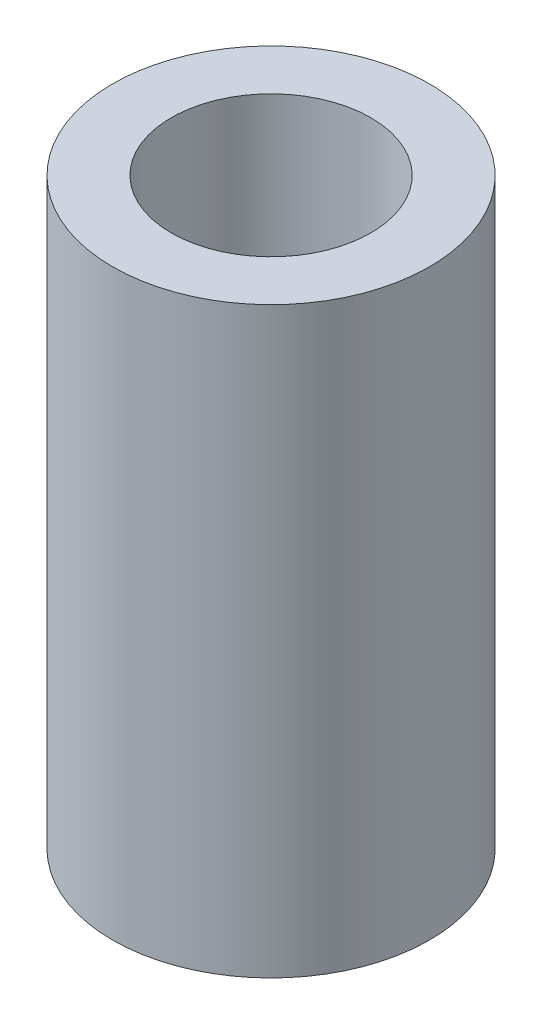
ISO-10303-21;
HEADER;
FILE_DESCRIPTION(('STEP AP214'),'2;1');
FILE_NAME('part.step','',(''),(''),'','','');
FILE_SCHEMA(('AUTOMOTIVE_DESIGN { 1 0 10303 214 1 1 1 1 }'));
ENDSEC;
DATA;
#1=APPLICATION_CONTEXT('core data for automotive mechanical design processes');
#2=APPLICATION_PROTOCOL_DEFINITION('international standard','automotive_design',2000,#1);
#3=PRODUCT_CONTEXT('',#1,'mechanical');
#4=PRODUCT('Part','Part','',(#3));
#5=PRODUCT_RELATED_PRODUCT_CATEGORY('part','',(#4));
#6=PRODUCT_DEFINITION_FORMATION('','',#4);
#7=PRODUCT_DEFINITION_CONTEXT('part definition',#1,'design');
#8=PRODUCT_DEFINITION('design','',#6,#7);
#9=PRODUCT_DEFINITION_SHAPE('','',#8);
#10=(LENGTH_UNIT() NAMED_UNIT(*) SI_UNIT(.MILLI.,.METRE.));
#11=(NAMED_UNIT(*) PLANE_ANGLE_UNIT() SI_UNIT($,.RADIAN.));
#12=(NAMED_UNIT(*) SI_UNIT($,.STERADIAN.) SOLID_ANGLE_UNIT());
#13=UNCERTAINTY_MEASURE_WITH_UNIT(LENGTH_MEASURE(1.E-05),#10,'distance_accuracy_value','');
#14=(GEOMETRIC_REPRESENTATION_CONTEXT(3) GLOBAL_UNCERTAINTY_ASSIGNED_CONTEXT((#13)) GLOBAL_UNIT_ASSIGNED_CONTEXT((#10,
#11,#12)) REPRESENTATION_CONTEXT('',''));
#15=CARTESIAN_POINT('',(0.,0.,0.));
#16=DIRECTION('',(0.,0.,1.));
#17=DIRECTION('',(1.,0.,0.));
#18=AXIS2_PLACEMENT_3D('',#15,#16,#17);
#19=CARTESIAN_POINT('',(0.,-11.684,0.));
#20=DIRECTION('',(0.,1.,0.));
#21=DIRECTION('',(0.,0.,1.));
#22=AXIS2_PLACEMENT_3D('',#19,#20,#21);
#23=CYLINDRICAL_SURFACE('',#22,3.175);
#24=CARTESIAN_POINT('',(0.,-11.684,0.));
#25=DIRECTION('',(0.,1.,0.));
#26=DIRECTION('',(0.,0.,1.));
#27=AXIS2_PLACEMENT_3D('',#24,#25,#26);
#28=CIRCLE('',#27,3.175);
#29=CARTESIAN_POINT('',(0.,-11.684,3.175));
#30=VERTEX_POINT('',#29);
#31=EDGE_CURVE('E10',#30,#30,#28,.T.);
#32=ORIENTED_EDGE('',*,*,#31,.T.);
#33=EDGE_LOOP('',(#32));
#34=FACE_BOUND('',#33,.T.);
#35=CARTESIAN_POINT('',(0.,0.,0.));
#36=DIRECTION('',(0.,1.,0.));
#37=DIRECTION('',(0.,0.,1.));
#38=AXIS2_PLACEMENT_3D('',#35,#36,#37);
#39=CIRCLE('',#38,3.175);
#40=CARTESIAN_POINT('',(0.,0.,3.175));
#41=VERTEX_POINT('',#40);
#42=EDGE_CURVE('E40',#41,#41,#39,.T.);
#43=ORIENTED_EDGE('',*,*,#42,.F.);
#44=EDGE_LOOP('',(#43));
#45=FACE_BOUND('',#44,.T.);
#46=ADVANCED_FACE('F37',(#34,#45),#23,.T.);
#47=CARTESIAN_POINT('',(0.,-11.684,0.));
#48=DIRECTION('',(0.,1.,0.));
#49=DIRECTION('',(0.,0.,1.));
#50=AXIS2_PLACEMENT_3D('',#47,#48,#49);
#51=PLANE('',#50);
#52=CARTESIAN_POINT('',(0.,-11.684,0.));
#53=DIRECTION('',(0.,1.,0.));
#54=DIRECTION('',(0.,0.,1.));
#55=AXIS2_PLACEMENT_3D('',#52,#53,#54);
#56=CIRCLE('',#55,2.);
#57=CARTESIAN_POINT('',(0.,-11.684,2.));
#58=VERTEX_POINT('',#57);
#59=EDGE_CURVE('E49',#58,#58,#56,.T.);
#60=ORIENTED_EDGE('',*,*,#59,.T.);
#61=EDGE_LOOP('',(#60));
#62=FACE_BOUND('',#61,.T.);
#63=ORIENTED_EDGE('',*,*,#31,.F.);
#64=EDGE_LOOP('',(#63));
#65=FACE_BOUND('',#64,.T.);
#66=ADVANCED_FACE('F59',(#62,#65),#51,.F.);
#67=CARTESIAN_POINT('',(0.,0.,0.));
#68=DIRECTION('',(0.,1.,0.));
#69=DIRECTION('',(0.,0.,1.));
#70=AXIS2_PLACEMENT_3D('',#67,#68,#69);
#71=PLANE('',#70);
#72=CARTESIAN_POINT('',(0.,0.,0.));
#73=DIRECTION('',(0.,1.,0.));
#74=DIRECTION('',(0.,0.,1.));
#75=AXIS2_PLACEMENT_3D('',#72,#73,#74);
#76=CIRCLE('',#75,2.);
#77=CARTESIAN_POINT('',(0.,0.,2.));
#78=VERTEX_POINT('',#77);
#79=EDGE_CURVE('E51',#78,#78,#76,.T.);
#80=ORIENTED_EDGE('',*,*,#79,.F.);
#81=EDGE_LOOP('',(#80));
#82=FACE_BOUND('',#81,.T.);
#83=ORIENTED_EDGE('',*,*,#42,.T.);
#84=EDGE_LOOP('',(#83));
#85=FACE_BOUND('',#84,.T.);
#86=ADVANCED_FACE('F65',(#82,#85),#71,.T.);
#87=CARTESIAN_POINT('',(0.,-11.684,0.));
#88=DIRECTION('',(0.,1.,0.));
#89=DIRECTION('',(0.,0.,1.));
#90=AXIS2_PLACEMENT_3D('',#87,#88,#89);
#91=CYLINDRICAL_SURFACE('',#90,2.);
#92=ORIENTED_EDGE('',*,*,#59,.F.);
#93=EDGE_LOOP('',(#92));
#94=FACE_BOUND('',#93,.T.);
#95=ORIENTED_EDGE('',*,*,#79,.T.);
#96=EDGE_LOOP('',(#95));
#97=FACE_BOUND('',#96,.T.);
#98=ADVANCED_FACE('F62',(#94,#97),#91,.F.);
#99=CLOSED_SHELL('',(#46,#66,#86,#98));
#100=MANIFOLD_SOLID_BREP('B2',#99);
#101=ADVANCED_BREP_SHAPE_REPRESENTATION('',(#18,#100),#14);
#102=SHAPE_DEFINITION_REPRESENTATION(#9,#101);
ENDSEC;
END-ISO-10303-21;
